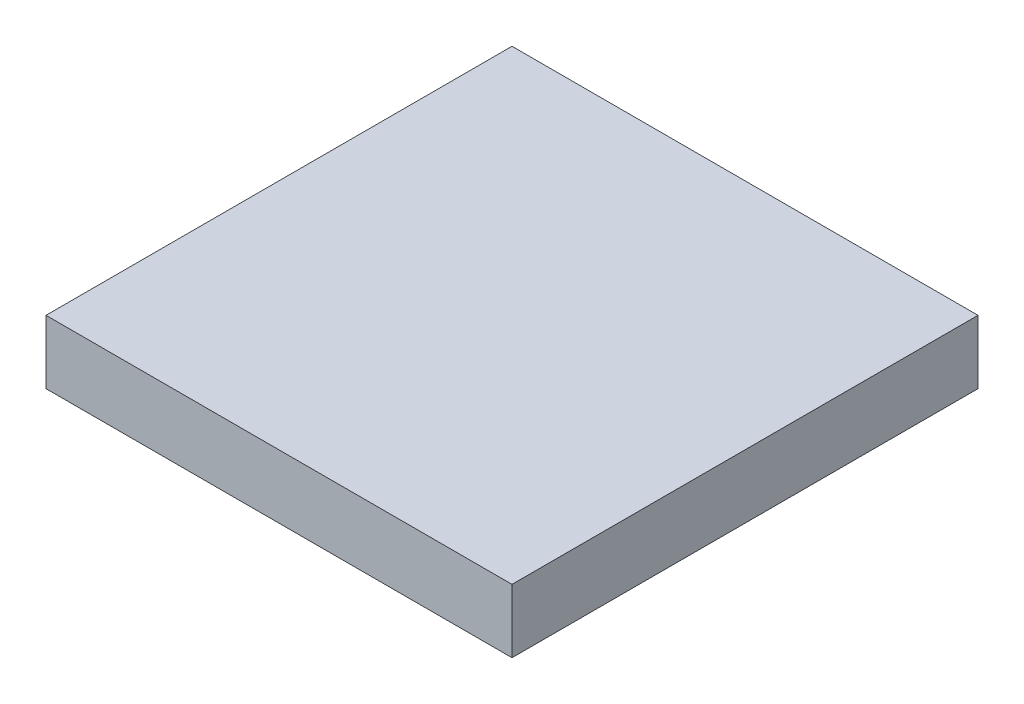
ISO-10303-21;
HEADER;
FILE_DESCRIPTION(('STEP AP214'),'2;1');
FILE_NAME('part.step','',(''),(''),'','','');
FILE_SCHEMA(('AUTOMOTIVE_DESIGN { 1 0 10303 214 1 1 1 1 }'));
ENDSEC;
DATA;
#1=APPLICATION_CONTEXT('core data for automotive mechanical design processes');
#2=APPLICATION_PROTOCOL_DEFINITION('international standard','automotive_design',2000,#1);
#3=PRODUCT_CONTEXT('',#1,'mechanical');
#4=PRODUCT('Part','Part','',(#3));
#5=PRODUCT_RELATED_PRODUCT_CATEGORY('part','',(#4));
#6=PRODUCT_DEFINITION_FORMATION('','',#4);
#7=PRODUCT_DEFINITION_CONTEXT('part definition',#1,'design');
#8=PRODUCT_DEFINITION('design','',#6,#7);
#9=PRODUCT_DEFINITION_SHAPE('','',#8);
#10=(LENGTH_UNIT() NAMED_UNIT(*) SI_UNIT(.MILLI.,.METRE.));
#11=(NAMED_UNIT(*) PLANE_ANGLE_UNIT() SI_UNIT($,.RADIAN.));
#12=(NAMED_UNIT(*) SI_UNIT($,.STERADIAN.) SOLID_ANGLE_UNIT());
#13=UNCERTAINTY_MEASURE_WITH_UNIT(LENGTH_MEASURE(1.E-05),#10,'distance_accuracy_value','');
#14=(GEOMETRIC_REPRESENTATION_CONTEXT(3) GLOBAL_UNCERTAINTY_ASSIGNED_CONTEXT((#13)) GLOBAL_UNIT_ASSIGNED_CONTEXT((#10,
#11,#12)) REPRESENTATION_CONTEXT('',''));
#15=CARTESIAN_POINT('',(0.,0.,0.));
#16=DIRECTION('',(0.,0.,1.));
#17=DIRECTION('',(1.,0.,0.));
#18=AXIS2_PLACEMENT_3D('',#15,#16,#17);
#19=CARTESIAN_POINT('',(0.,30.,0.));
#20=DIRECTION('',(1.,0.,0.));
#21=DIRECTION('',(0.,0.,-1.));
#22=AXIS2_PLACEMENT_3D('',#19,#20,#21);
#23=PLANE('',#22);
#24=DIRECTION('',(0.,0.,1.));
#25=VECTOR('',#24,1.);
#26=CARTESIAN_POINT('',(0.,0.,0.));
#27=LINE('',#26,#25);
#28=CARTESIAN_POINT('',(0.,0.,-220.));
#29=VERTEX_POINT('',#28);
#30=CARTESIAN_POINT('',(0.,0.,0.));
#31=VERTEX_POINT('',#30);
#32=EDGE_CURVE('E97',#29,#31,#27,.T.);
#33=ORIENTED_EDGE('',*,*,#32,.T.);
#34=DIRECTION('',(0.,-1.,0.));
#35=VECTOR('',#34,1.);
#36=CARTESIAN_POINT('',(0.,30.,0.));
#37=LINE('',#36,#35);
#38=CARTESIAN_POINT('',(0.,30.,0.));
#39=VERTEX_POINT('',#38);
#40=EDGE_CURVE('E11',#39,#31,#37,.T.);
#41=ORIENTED_EDGE('',*,*,#40,.F.);
#42=DIRECTION('',(0.,0.,1.));
#43=VECTOR('',#42,1.);
#44=CARTESIAN_POINT('',(0.,30.,0.));
#45=LINE('',#44,#43);
#46=CARTESIAN_POINT('',(0.,30.,-220.));
#47=VERTEX_POINT('',#46);
#48=EDGE_CURVE('E85',#47,#39,#45,.T.);
#49=ORIENTED_EDGE('',*,*,#48,.F.);
#50=DIRECTION('',(0.,-1.,0.));
#51=VECTOR('',#50,1.);
#52=CARTESIAN_POINT('',(0.,30.,-220.));
#53=LINE('',#52,#51);
#54=EDGE_CURVE('E93',#47,#29,#53,.T.);
#55=ORIENTED_EDGE('',*,*,#54,.T.);
#56=EDGE_LOOP('',(#33,#41,#49,#55));
#57=FACE_BOUND('',#56,.T.);
#58=ADVANCED_FACE('F34',(#57),#23,.F.);
#59=CARTESIAN_POINT('',(0.,30.,0.));
#60=DIRECTION('',(0.,0.,-1.));
#61=DIRECTION('',(-1.,0.,0.));
#62=AXIS2_PLACEMENT_3D('',#59,#60,#61);
#63=PLANE('',#62);
#64=DIRECTION('',(1.,0.,0.));
#65=VECTOR('',#64,1.);
#66=CARTESIAN_POINT('',(0.,0.,0.));
#67=LINE('',#66,#65);
#68=CARTESIAN_POINT('',(220.,0.,0.));
#69=VERTEX_POINT('',#68);
#70=EDGE_CURVE('E89',#31,#69,#67,.T.);
#71=ORIENTED_EDGE('',*,*,#70,.T.);
#72=DIRECTION('',(0.,-1.,0.));
#73=VECTOR('',#72,1.);
#74=CARTESIAN_POINT('',(220.,30.,0.));
#75=LINE('',#74,#73);
#76=CARTESIAN_POINT('',(220.,30.,0.));
#77=VERTEX_POINT('',#76);
#78=EDGE_CURVE('E42',#77,#69,#75,.T.);
#79=ORIENTED_EDGE('',*,*,#78,.F.);
#80=DIRECTION('',(1.,0.,0.));
#81=VECTOR('',#80,1.);
#82=CARTESIAN_POINT('',(0.,30.,0.));
#83=LINE('',#82,#81);
#84=EDGE_CURVE('E80',#39,#77,#83,.T.);
#85=ORIENTED_EDGE('',*,*,#84,.F.);
#86=ORIENTED_EDGE('',*,*,#40,.T.);
#87=EDGE_LOOP('',(#71,#79,#85,#86));
#88=FACE_BOUND('',#87,.T.);
#89=ADVANCED_FACE('F88',(#88),#63,.F.);
#90=CARTESIAN_POINT('',(220.,30.,0.));
#91=DIRECTION('',(-1.,0.,0.));
#92=DIRECTION('',(0.,0.,1.));
#93=AXIS2_PLACEMENT_3D('',#90,#91,#92);
#94=PLANE('',#93);
#95=DIRECTION('',(0.,0.,-1.));
#96=VECTOR('',#95,1.);
#97=CARTESIAN_POINT('',(220.,0.,0.));
#98=LINE('',#97,#96);
#99=CARTESIAN_POINT('',(220.,0.,-220.));
#100=VERTEX_POINT('',#99);
#101=EDGE_CURVE('E67',#69,#100,#98,.T.);
#102=ORIENTED_EDGE('',*,*,#101,.T.);
#103=DIRECTION('',(0.,-1.,0.));
#104=VECTOR('',#103,1.);
#105=CARTESIAN_POINT('',(220.,30.,-220.));
#106=LINE('',#105,#104);
#107=CARTESIAN_POINT('',(220.,30.,-220.));
#108=VERTEX_POINT('',#107);
#109=EDGE_CURVE('E90',#108,#100,#106,.T.);
#110=ORIENTED_EDGE('',*,*,#109,.F.);
#111=DIRECTION('',(0.,0.,-1.));
#112=VECTOR('',#111,1.);
#113=CARTESIAN_POINT('',(220.,30.,0.));
#114=LINE('',#113,#112);
#115=EDGE_CURVE('E83',#77,#108,#114,.T.);
#116=ORIENTED_EDGE('',*,*,#115,.F.);
#117=ORIENTED_EDGE('',*,*,#78,.T.);
#118=EDGE_LOOP('',(#102,#110,#116,#117));
#119=FACE_BOUND('',#118,.T.);
#120=ADVANCED_FACE('F91',(#119),#94,.F.);
#121=CARTESIAN_POINT('',(0.,30.,-220.));
#122=DIRECTION('',(0.,0.,1.));
#123=DIRECTION('',(1.,0.,0.));
#124=AXIS2_PLACEMENT_3D('',#121,#122,#123);
#125=PLANE('',#124);
#126=DIRECTION('',(-1.,0.,0.));
#127=VECTOR('',#126,1.);
#128=CARTESIAN_POINT('',(0.,0.,-220.));
#129=LINE('',#128,#127);
#130=EDGE_CURVE('E73',#100,#29,#129,.T.);
#131=ORIENTED_EDGE('',*,*,#130,.T.);
#132=ORIENTED_EDGE('',*,*,#54,.F.);
#133=DIRECTION('',(-1.,0.,0.));
#134=VECTOR('',#133,1.);
#135=CARTESIAN_POINT('',(0.,30.,-220.));
#136=LINE('',#135,#134);
#137=EDGE_CURVE('E50',#108,#47,#136,.T.);
#138=ORIENTED_EDGE('',*,*,#137,.F.);
#139=ORIENTED_EDGE('',*,*,#109,.T.);
#140=EDGE_LOOP('',(#131,#132,#138,#139));
#141=FACE_BOUND('',#140,.T.);
#142=ADVANCED_FACE('F104',(#141),#125,.F.);
#143=CARTESIAN_POINT('',(0.,30.,0.));
#144=DIRECTION('',(0.,-1.,0.));
#145=DIRECTION('',(0.,0.,-1.));
#146=AXIS2_PLACEMENT_3D('',#143,#144,#145);
#147=PLANE('',#146);
#148=ORIENTED_EDGE('',*,*,#48,.T.);
#149=ORIENTED_EDGE('',*,*,#84,.T.);
#150=ORIENTED_EDGE('',*,*,#115,.T.);
#151=ORIENTED_EDGE('',*,*,#137,.T.);
#152=EDGE_LOOP('',(#148,#149,#150,#151));
#153=FACE_BOUND('',#152,.T.);
#154=ADVANCED_FACE('F81',(#153),#147,.F.);
#155=CARTESIAN_POINT('',(0.,0.,0.));
#156=DIRECTION('',(0.,-1.,0.));
#157=DIRECTION('',(0.,0.,-1.));
#158=AXIS2_PLACEMENT_3D('',#155,#156,#157);
#159=PLANE('',#158);
#160=ORIENTED_EDGE('',*,*,#32,.F.);
#161=ORIENTED_EDGE('',*,*,#130,.F.);
#162=ORIENTED_EDGE('',*,*,#101,.F.);
#163=ORIENTED_EDGE('',*,*,#70,.F.);
#164=EDGE_LOOP('',(#160,#161,#162,#163));
#165=FACE_BOUND('',#164,.T.);
#166=ADVANCED_FACE('F107',(#165),#159,.T.);
#167=CLOSED_SHELL('',(#58,#89,#120,#142,#154,#166));
#168=MANIFOLD_SOLID_BREP('B2',#167);
#169=ADVANCED_BREP_SHAPE_REPRESENTATION('',(#18,#168),#14);
#170=SHAPE_DEFINITION_REPRESENTATION(#9,#169);
ENDSEC;
END-ISO-10303-21;
